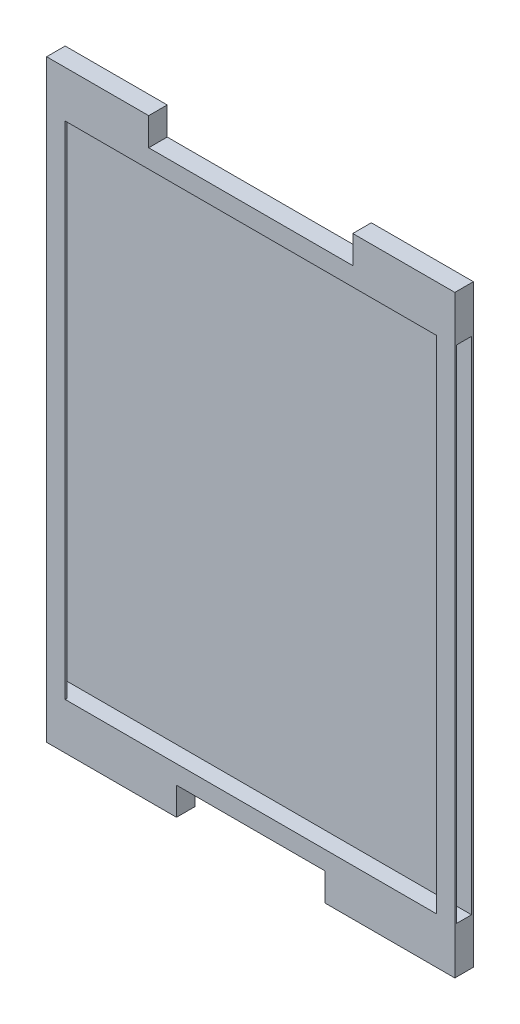
ISO-10303-21;
HEADER;
FILE_DESCRIPTION(('STEP AP214'),'2;1');
FILE_NAME('part.step','',(''),(''),'','','');
FILE_SCHEMA(('AUTOMOTIVE_DESIGN { 1 0 10303 214 1 1 1 1 }'));
ENDSEC;
DATA;
#1=APPLICATION_CONTEXT('core data for automotive mechanical design processes');
#2=APPLICATION_PROTOCOL_DEFINITION('international standard','automotive_design',2000,#1);
#3=PRODUCT_CONTEXT('',#1,'mechanical');
#4=PRODUCT('Part','Part','',(#3));
#5=PRODUCT_RELATED_PRODUCT_CATEGORY('part','',(#4));
#6=PRODUCT_DEFINITION_FORMATION('','',#4);
#7=PRODUCT_DEFINITION_CONTEXT('part definition',#1,'design');
#8=PRODUCT_DEFINITION('design','',#6,#7);
#9=PRODUCT_DEFINITION_SHAPE('','',#8);
#10=(LENGTH_UNIT() NAMED_UNIT(*) SI_UNIT(.MILLI.,.METRE.));
#11=(NAMED_UNIT(*) PLANE_ANGLE_UNIT() SI_UNIT($,.RADIAN.));
#12=(NAMED_UNIT(*) SI_UNIT($,.STERADIAN.) SOLID_ANGLE_UNIT());
#13=UNCERTAINTY_MEASURE_WITH_UNIT(LENGTH_MEASURE(1.E-05),#10,'distance_accuracy_value','');
#14=(GEOMETRIC_REPRESENTATION_CONTEXT(3) GLOBAL_UNCERTAINTY_ASSIGNED_CONTEXT((#13)) GLOBAL_UNIT_ASSIGNED_CONTEXT((#10,
#11,#12)) REPRESENTATION_CONTEXT('',''));
#15=CARTESIAN_POINT('',(0.,0.,0.));
#16=DIRECTION('',(0.,0.,1.));
#17=DIRECTION('',(1.,0.,0.));
#18=AXIS2_PLACEMENT_3D('',#15,#16,#17);
#19=CARTESIAN_POINT('',(-55.,0.,0.));
#20=DIRECTION('',(-1.,0.,0.));
#21=DIRECTION('',(0.,0.,1.));
#22=AXIS2_PLACEMENT_3D('',#19,#20,#21);
#23=PLANE('',#22);
#24=DIRECTION('',(0.,1.,0.));
#25=VECTOR('',#24,1.);
#26=CARTESIAN_POINT('',(-55.,0.,-5.));
#27=LINE('',#26,#25);
#28=CARTESIAN_POINT('',(-55.,145.,-5.));
#29=VERTEX_POINT('',#28);
#30=CARTESIAN_POINT('',(-55.,160.,-5.));
#31=VERTEX_POINT('',#30);
#32=EDGE_CURVE('E200',#29,#31,#27,.T.);
#33=ORIENTED_EDGE('',*,*,#32,.T.);
#34=DIRECTION('',(0.,0.,-1.));
#35=VECTOR('',#34,1.);
#36=CARTESIAN_POINT('',(-55.,160.,0.));
#37=LINE('',#36,#35);
#38=CARTESIAN_POINT('',(-55.,160.,5.));
#39=VERTEX_POINT('',#38);
#40=EDGE_CURVE('E272',#31,#39,#37,.F.);
#41=ORIENTED_EDGE('',*,*,#40,.T.);
#42=DIRECTION('',(0.,1.,0.));
#43=VECTOR('',#42,1.);
#44=CARTESIAN_POINT('',(-55.,0.,5.));
#45=LINE('',#44,#43);
#46=CARTESIAN_POINT('',(-55.,145.,5.));
#47=VERTEX_POINT('',#46);
#48=EDGE_CURVE('E203',#39,#47,#45,.F.);
#49=ORIENTED_EDGE('',*,*,#48,.T.);
#50=DIRECTION('',(0.,0.,-1.));
#51=VECTOR('',#50,1.);
#52=CARTESIAN_POINT('',(-55.,145.,0.));
#53=LINE('',#52,#51);
#54=EDGE_CURVE('E20',#47,#29,#53,.T.);
#55=ORIENTED_EDGE('',*,*,#54,.T.);
#56=EDGE_LOOP('',(#33,#41,#49,#55));
#57=FACE_BOUND('',#56,.T.);
#58=ADVANCED_FACE('F17',(#57),#23,.F.);
#59=CARTESIAN_POINT('',(0.,145.,0.));
#60=DIRECTION('',(0.,-1.,0.));
#61=DIRECTION('',(0.,0.,-1.));
#62=AXIS2_PLACEMENT_3D('',#59,#60,#61);
#63=PLANE('',#62);
#64=DIRECTION('',(1.,0.,0.));
#65=VECTOR('',#64,1.);
#66=CARTESIAN_POINT('',(0.,145.,-5.));
#67=LINE('',#66,#65);
#68=CARTESIAN_POINT('',(55.,145.,-5.));
#69=VERTEX_POINT('',#68);
#70=EDGE_CURVE('E207',#69,#29,#67,.F.);
#71=ORIENTED_EDGE('',*,*,#70,.T.);
#72=ORIENTED_EDGE('',*,*,#54,.F.);
#73=DIRECTION('',(1.,0.,0.));
#74=VECTOR('',#73,1.);
#75=CARTESIAN_POINT('',(0.,145.,5.));
#76=LINE('',#75,#74);
#77=CARTESIAN_POINT('',(55.,145.,5.));
#78=VERTEX_POINT('',#77);
#79=EDGE_CURVE('E251',#47,#78,#76,.T.);
#80=ORIENTED_EDGE('',*,*,#79,.T.);
#81=DIRECTION('',(0.,0.,-1.));
#82=VECTOR('',#81,1.);
#83=CARTESIAN_POINT('',(55.,145.,0.));
#84=LINE('',#83,#82);
#85=EDGE_CURVE('E193',#78,#69,#84,.T.);
#86=ORIENTED_EDGE('',*,*,#85,.T.);
#87=EDGE_LOOP('',(#71,#72,#80,#86));
#88=FACE_BOUND('',#87,.T.);
#89=ADVANCED_FACE('F211',(#88),#63,.F.);
#90=CARTESIAN_POINT('',(55.,0.,0.));
#91=DIRECTION('',(1.,0.,0.));
#92=DIRECTION('',(0.,0.,-1.));
#93=AXIS2_PLACEMENT_3D('',#90,#91,#92);
#94=PLANE('',#93);
#95=DIRECTION('',(0.,1.,0.));
#96=VECTOR('',#95,1.);
#97=CARTESIAN_POINT('',(55.,0.,-5.));
#98=LINE('',#97,#96);
#99=CARTESIAN_POINT('',(55.,160.,-5.));
#100=VERTEX_POINT('',#99);
#101=EDGE_CURVE('E212',#100,#69,#98,.F.);
#102=ORIENTED_EDGE('',*,*,#101,.T.);
#103=ORIENTED_EDGE('',*,*,#85,.F.);
#104=DIRECTION('',(0.,1.,0.));
#105=VECTOR('',#104,1.);
#106=CARTESIAN_POINT('',(55.,0.,5.));
#107=LINE('',#106,#105);
#108=CARTESIAN_POINT('',(55.,160.,5.));
#109=VERTEX_POINT('',#108);
#110=EDGE_CURVE('E248',#78,#109,#107,.T.);
#111=ORIENTED_EDGE('',*,*,#110,.T.);
#112=DIRECTION('',(0.,0.,-1.));
#113=VECTOR('',#112,1.);
#114=CARTESIAN_POINT('',(55.,160.,0.));
#115=LINE('',#114,#113);
#116=EDGE_CURVE('E192',#109,#100,#115,.T.);
#117=ORIENTED_EDGE('',*,*,#116,.T.);
#118=EDGE_LOOP('',(#102,#103,#111,#117));
#119=FACE_BOUND('',#118,.T.);
#120=ADVANCED_FACE('F417',(#119),#94,.F.);
#121=CARTESIAN_POINT('',(0.,160.,0.));
#122=DIRECTION('',(0.,-1.,0.));
#123=DIRECTION('',(0.,0.,-1.));
#124=AXIS2_PLACEMENT_3D('',#121,#122,#123);
#125=PLANE('',#124);
#126=DIRECTION('',(1.,0.,0.));
#127=VECTOR('',#126,1.);
#128=CARTESIAN_POINT('',(0.,160.,-5.));
#129=LINE('',#128,#127);
#130=CARTESIAN_POINT('',(110.,160.,-5.));
#131=VERTEX_POINT('',#130);
#132=EDGE_CURVE('E214',#131,#100,#129,.F.);
#133=ORIENTED_EDGE('',*,*,#132,.T.);
#134=ORIENTED_EDGE('',*,*,#116,.F.);
#135=DIRECTION('',(1.,0.,0.));
#136=VECTOR('',#135,1.);
#137=CARTESIAN_POINT('',(0.,160.,5.));
#138=LINE('',#137,#136);
#139=CARTESIAN_POINT('',(110.,160.,5.));
#140=VERTEX_POINT('',#139);
#141=EDGE_CURVE('E245',#109,#140,#138,.T.);
#142=ORIENTED_EDGE('',*,*,#141,.T.);
#143=DIRECTION('',(0.,0.,-1.));
#144=VECTOR('',#143,1.);
#145=CARTESIAN_POINT('',(110.,160.,0.));
#146=LINE('',#145,#144);
#147=EDGE_CURVE('E269',#140,#131,#146,.T.);
#148=ORIENTED_EDGE('',*,*,#147,.T.);
#149=EDGE_LOOP('',(#133,#134,#142,#148));
#150=FACE_BOUND('',#149,.T.);
#151=ADVANCED_FACE('F413',(#150),#125,.F.);
#152=CARTESIAN_POINT('',(0.,-160.,0.));
#153=DIRECTION('',(0.,1.,0.));
#154=DIRECTION('',(0.,0.,1.));
#155=AXIS2_PLACEMENT_3D('',#152,#153,#154);
#156=PLANE('',#155);
#157=DIRECTION('',(1.,0.,0.));
#158=VECTOR('',#157,1.);
#159=CARTESIAN_POINT('',(0.,-160.,-5.));
#160=LINE('',#159,#158);
#161=CARTESIAN_POINT('',(40.,-160.,-5.));
#162=VERTEX_POINT('',#161);
#163=CARTESIAN_POINT('',(110.,-160.,-5.));
#164=VERTEX_POINT('',#163);
#165=EDGE_CURVE('E220',#162,#164,#160,.T.);
#166=ORIENTED_EDGE('',*,*,#165,.T.);
#167=DIRECTION('',(0.,0.,-1.));
#168=VECTOR('',#167,1.);
#169=CARTESIAN_POINT('',(110.,-160.,0.));
#170=LINE('',#169,#168);
#171=CARTESIAN_POINT('',(110.,-160.,5.));
#172=VERTEX_POINT('',#171);
#173=EDGE_CURVE('E264',#164,#172,#170,.F.);
#174=ORIENTED_EDGE('',*,*,#173,.T.);
#175=DIRECTION('',(1.,0.,0.));
#176=VECTOR('',#175,1.);
#177=CARTESIAN_POINT('',(0.,-160.,5.));
#178=LINE('',#177,#176);
#179=CARTESIAN_POINT('',(40.,-160.,5.));
#180=VERTEX_POINT('',#179);
#181=EDGE_CURVE('E237',#172,#180,#178,.F.);
#182=ORIENTED_EDGE('',*,*,#181,.T.);
#183=DIRECTION('',(0.,0.,1.));
#184=VECTOR('',#183,1.);
#185=CARTESIAN_POINT('',(40.,-160.,0.));
#186=LINE('',#185,#184);
#187=EDGE_CURVE('E190',#180,#162,#186,.F.);
#188=ORIENTED_EDGE('',*,*,#187,.T.);
#189=EDGE_LOOP('',(#166,#174,#182,#188));
#190=FACE_BOUND('',#189,.T.);
#191=ADVANCED_FACE('F410',(#190),#156,.F.);
#192=CARTESIAN_POINT('',(40.,0.,0.));
#193=DIRECTION('',(-1.,0.,0.));
#194=DIRECTION('',(0.,0.,1.));
#195=AXIS2_PLACEMENT_3D('',#192,#193,#194);
#196=PLANE('',#195);
#197=DIRECTION('',(0.,1.,0.));
#198=VECTOR('',#197,1.);
#199=CARTESIAN_POINT('',(40.,0.,-5.));
#200=LINE('',#199,#198);
#201=CARTESIAN_POINT('',(40.,-145.,-5.));
#202=VERTEX_POINT('',#201);
#203=EDGE_CURVE('E222',#202,#162,#200,.F.);
#204=ORIENTED_EDGE('',*,*,#203,.T.);
#205=ORIENTED_EDGE('',*,*,#187,.F.);
#206=DIRECTION('',(0.,1.,0.));
#207=VECTOR('',#206,1.);
#208=CARTESIAN_POINT('',(40.,0.,5.));
#209=LINE('',#208,#207);
#210=CARTESIAN_POINT('',(40.,-145.,5.));
#211=VERTEX_POINT('',#210);
#212=EDGE_CURVE('E233',#180,#211,#209,.T.);
#213=ORIENTED_EDGE('',*,*,#212,.T.);
#214=DIRECTION('',(0.,0.,-1.));
#215=VECTOR('',#214,1.);
#216=CARTESIAN_POINT('',(40.,-145.,0.));
#217=LINE('',#216,#215);
#218=EDGE_CURVE('E188',#211,#202,#217,.T.);
#219=ORIENTED_EDGE('',*,*,#218,.T.);
#220=EDGE_LOOP('',(#204,#205,#213,#219));
#221=FACE_BOUND('',#220,.T.);
#222=ADVANCED_FACE('F236',(#221),#196,.T.);
#223=CARTESIAN_POINT('',(0.,-145.,0.));
#224=DIRECTION('',(0.,-1.,0.));
#225=DIRECTION('',(0.,0.,-1.));
#226=AXIS2_PLACEMENT_3D('',#223,#224,#225);
#227=PLANE('',#226);
#228=DIRECTION('',(1.,0.,0.));
#229=VECTOR('',#228,1.);
#230=CARTESIAN_POINT('',(0.,-145.,-5.));
#231=LINE('',#230,#229);
#232=CARTESIAN_POINT('',(-40.,-145.,-5.));
#233=VERTEX_POINT('',#232);
#234=EDGE_CURVE('E175',#233,#202,#231,.T.);
#235=ORIENTED_EDGE('',*,*,#234,.T.);
#236=ORIENTED_EDGE('',*,*,#218,.F.);
#237=DIRECTION('',(1.,0.,0.));
#238=VECTOR('',#237,1.);
#239=CARTESIAN_POINT('',(0.,-145.,5.));
#240=LINE('',#239,#238);
#241=CARTESIAN_POINT('',(-40.,-145.,5.));
#242=VERTEX_POINT('',#241);
#243=EDGE_CURVE('E226',#211,#242,#240,.F.);
#244=ORIENTED_EDGE('',*,*,#243,.T.);
#245=DIRECTION('',(0.,0.,-1.));
#246=VECTOR('',#245,1.);
#247=CARTESIAN_POINT('',(-40.,-145.,0.));
#248=LINE('',#247,#246);
#249=EDGE_CURVE('E151',#242,#233,#248,.T.);
#250=ORIENTED_EDGE('',*,*,#249,.T.);
#251=EDGE_LOOP('',(#235,#236,#244,#250));
#252=FACE_BOUND('',#251,.T.);
#253=ADVANCED_FACE('F224',(#252),#227,.T.);
#254=CARTESIAN_POINT('',(-40.,0.,0.));
#255=DIRECTION('',(1.,0.,0.));
#256=DIRECTION('',(0.,0.,-1.));
#257=AXIS2_PLACEMENT_3D('',#254,#255,#256);
#258=PLANE('',#257);
#259=DIRECTION('',(0.,1.,0.));
#260=VECTOR('',#259,1.);
#261=CARTESIAN_POINT('',(-40.,0.,-5.));
#262=LINE('',#261,#260);
#263=CARTESIAN_POINT('',(-40.,-160.,-5.));
#264=VERTEX_POINT('',#263);
#265=EDGE_CURVE('E160',#264,#233,#262,.T.);
#266=ORIENTED_EDGE('',*,*,#265,.T.);
#267=ORIENTED_EDGE('',*,*,#249,.F.);
#268=DIRECTION('',(0.,1.,0.));
#269=VECTOR('',#268,1.);
#270=CARTESIAN_POINT('',(-40.,0.,5.));
#271=LINE('',#270,#269);
#272=CARTESIAN_POINT('',(-40.,-160.,5.));
#273=VERTEX_POINT('',#272);
#274=EDGE_CURVE('E162',#242,#273,#271,.F.);
#275=ORIENTED_EDGE('',*,*,#274,.T.);
#276=DIRECTION('',(0.,0.,1.));
#277=VECTOR('',#276,1.);
#278=CARTESIAN_POINT('',(-40.,-160.,0.));
#279=LINE('',#278,#277);
#280=EDGE_CURVE('E157',#273,#264,#279,.F.);
#281=ORIENTED_EDGE('',*,*,#280,.T.);
#282=EDGE_LOOP('',(#266,#267,#275,#281));
#283=FACE_BOUND('',#282,.T.);
#284=ADVANCED_FACE('F159',(#283),#258,.T.);
#285=CARTESIAN_POINT('',(100.,0.,0.));
#286=DIRECTION('',(-1.,0.,0.));
#287=DIRECTION('',(0.,0.,1.));
#288=AXIS2_PLACEMENT_3D('',#285,#286,#287);
#289=PLANE('',#288);
#290=DIRECTION('',(0.,1.,0.));
#291=VECTOR('',#290,1.);
#292=CARTESIAN_POINT('',(100.,0.,5.));
#293=LINE('',#292,#291);
#294=CARTESIAN_POINT('',(100.,-135.,5.));
#295=VERTEX_POINT('',#294);
#296=CARTESIAN_POINT('',(100.,135.,5.));
#297=VERTEX_POINT('',#296);
#298=EDGE_CURVE('E305',#295,#297,#293,.T.);
#299=ORIENTED_EDGE('',*,*,#298,.T.);
#300=DIRECTION('',(0.,0.,1.));
#301=VECTOR('',#300,1.);
#302=CARTESIAN_POINT('',(100.,135.,0.));
#303=LINE('',#302,#301);
#304=CARTESIAN_POINT('',(100.,135.,4.));
#305=VERTEX_POINT('',#304);
#306=EDGE_CURVE('E185',#305,#297,#303,.T.);
#307=ORIENTED_EDGE('',*,*,#306,.F.);
#308=DIRECTION('',(0.,1.,0.));
#309=VECTOR('',#308,1.);
#310=CARTESIAN_POINT('',(100.,0.,4.));
#311=LINE('',#310,#309);
#312=CARTESIAN_POINT('',(100.,-135.,4.));
#313=VERTEX_POINT('',#312);
#314=EDGE_CURVE('E257',#305,#313,#311,.F.);
#315=ORIENTED_EDGE('',*,*,#314,.T.);
#316=DIRECTION('',(0.,0.,1.));
#317=VECTOR('',#316,1.);
#318=CARTESIAN_POINT('',(100.,-135.,0.));
#319=LINE('',#318,#317);
#320=EDGE_CURVE('E167',#295,#313,#319,.F.);
#321=ORIENTED_EDGE('',*,*,#320,.F.);
#322=EDGE_LOOP('',(#299,#307,#315,#321));
#323=FACE_BOUND('',#322,.T.);
#324=ADVANCED_FACE('F381',(#323),#289,.T.);
#325=CARTESIAN_POINT('',(0.,-160.,0.));
#326=DIRECTION('',(0.,1.,0.));
#327=DIRECTION('',(0.,0.,1.));
#328=AXIS2_PLACEMENT_3D('',#325,#326,#327);
#329=PLANE('',#328);
#330=DIRECTION('',(1.,0.,0.));
#331=VECTOR('',#330,1.);
#332=CARTESIAN_POINT('',(0.,-160.,-5.));
#333=LINE('',#332,#331);
#334=CARTESIAN_POINT('',(-110.,-160.,-5.));
#335=VERTEX_POINT('',#334);
#336=EDGE_CURVE('E166',#335,#264,#333,.T.);
#337=ORIENTED_EDGE('',*,*,#336,.T.);
#338=ORIENTED_EDGE('',*,*,#280,.F.);
#339=DIRECTION('',(1.,0.,0.));
#340=VECTOR('',#339,1.);
#341=CARTESIAN_POINT('',(0.,-160.,5.));
#342=LINE('',#341,#340);
#343=CARTESIAN_POINT('',(-110.,-160.,5.));
#344=VERTEX_POINT('',#343);
#345=EDGE_CURVE('E308',#273,#344,#342,.F.);
#346=ORIENTED_EDGE('',*,*,#345,.T.);
#347=DIRECTION('',(0.,0.,1.));
#348=VECTOR('',#347,1.);
#349=CARTESIAN_POINT('',(-110.,-160.,0.));
#350=LINE('',#349,#348);
#351=EDGE_CURVE('E180',#344,#335,#350,.F.);
#352=ORIENTED_EDGE('',*,*,#351,.T.);
#353=EDGE_LOOP('',(#337,#338,#346,#352));
#354=FACE_BOUND('',#353,.T.);
#355=ADVANCED_FACE('F178',(#354),#329,.F.);
#356=CARTESIAN_POINT('',(0.,0.,-5.));
#357=DIRECTION('',(0.,0.,1.));
#358=DIRECTION('',(1.,0.,0.));
#359=AXIS2_PLACEMENT_3D('',#356,#357,#358);
#360=PLANE('',#359);
#361=ORIENTED_EDGE('',*,*,#32,.F.);
#362=ORIENTED_EDGE('',*,*,#70,.F.);
#363=ORIENTED_EDGE('',*,*,#101,.F.);
#364=ORIENTED_EDGE('',*,*,#132,.F.);
#365=DIRECTION('',(0.,1.,0.));
#366=VECTOR('',#365,1.);
#367=CARTESIAN_POINT('',(110.,0.,-5.));
#368=LINE('',#367,#366);
#369=EDGE_CURVE('E266',#131,#164,#368,.F.);
#370=ORIENTED_EDGE('',*,*,#369,.T.);
#371=ORIENTED_EDGE('',*,*,#165,.F.);
#372=ORIENTED_EDGE('',*,*,#203,.F.);
#373=ORIENTED_EDGE('',*,*,#234,.F.);
#374=ORIENTED_EDGE('',*,*,#265,.F.);
#375=ORIENTED_EDGE('',*,*,#336,.F.);
#376=DIRECTION('',(0.,1.,0.));
#377=VECTOR('',#376,1.);
#378=CARTESIAN_POINT('',(-110.,0.,-5.));
#379=LINE('',#378,#377);
#380=CARTESIAN_POINT('',(-110.,160.,-5.));
#381=VERTEX_POINT('',#380);
#382=EDGE_CURVE('E283',#335,#381,#379,.T.);
#383=ORIENTED_EDGE('',*,*,#382,.T.);
#384=DIRECTION('',(1.,0.,0.));
#385=VECTOR('',#384,1.);
#386=CARTESIAN_POINT('',(0.,160.,-5.));
#387=LINE('',#386,#385);
#388=EDGE_CURVE('E209',#381,#31,#387,.T.);
#389=ORIENTED_EDGE('',*,*,#388,.T.);
#390=EDGE_LOOP('',(#361,#362,#363,#364,#370,#371,#372,#373,#374,#375,#383,#389));
#391=FACE_BOUND('',#390,.T.);
#392=ADVANCED_FACE('F171',(#391),#360,.F.);
#393=CARTESIAN_POINT('',(0.,160.,0.));
#394=DIRECTION('',(0.,-1.,0.));
#395=DIRECTION('',(0.,0.,-1.));
#396=AXIS2_PLACEMENT_3D('',#393,#394,#395);
#397=PLANE('',#396);
#398=ORIENTED_EDGE('',*,*,#388,.F.);
#399=DIRECTION('',(0.,0.,1.));
#400=VECTOR('',#399,1.);
#401=CARTESIAN_POINT('',(-110.,160.,0.));
#402=LINE('',#401,#400);
#403=CARTESIAN_POINT('',(-110.,160.,5.));
#404=VERTEX_POINT('',#403);
#405=EDGE_CURVE('E280',#381,#404,#402,.T.);
#406=ORIENTED_EDGE('',*,*,#405,.T.);
#407=DIRECTION('',(1.,0.,0.));
#408=VECTOR('',#407,1.);
#409=CARTESIAN_POINT('',(0.,160.,5.));
#410=LINE('',#409,#408);
#411=EDGE_CURVE('E254',#404,#39,#410,.T.);
#412=ORIENTED_EDGE('',*,*,#411,.T.);
#413=ORIENTED_EDGE('',*,*,#40,.F.);
#414=EDGE_LOOP('',(#398,#406,#412,#413));
#415=FACE_BOUND('',#414,.T.);
#416=ADVANCED_FACE('F278',(#415),#397,.F.);
#417=CARTESIAN_POINT('',(0.,0.,-4.));
#418=DIRECTION('',(0.,0.,-1.));
#419=DIRECTION('',(-1.,0.,0.));
#420=AXIS2_PLACEMENT_3D('',#417,#418,#419);
#421=PLANE('',#420);
#422=DIRECTION('',(1.,0.,0.));
#423=VECTOR('',#422,1.);
#424=CARTESIAN_POINT('',(0.,-135.,-4.));
#425=LINE('',#424,#423);
#426=CARTESIAN_POINT('',(-110.,-135.,-4.));
#427=VERTEX_POINT('',#426);
#428=CARTESIAN_POINT('',(110.,-135.,-4.));
#429=VERTEX_POINT('',#428);
#430=EDGE_CURVE('E362',#427,#429,#425,.T.);
#431=ORIENTED_EDGE('',*,*,#430,.T.);
#432=DIRECTION('',(0.,1.,0.));
#433=VECTOR('',#432,1.);
#434=CARTESIAN_POINT('',(110.,0.,-4.));
#435=LINE('',#434,#433);
#436=CARTESIAN_POINT('',(110.,135.,-4.));
#437=VERTEX_POINT('',#436);
#438=EDGE_CURVE('E262',#429,#437,#435,.T.);
#439=ORIENTED_EDGE('',*,*,#438,.T.);
#440=DIRECTION('',(1.,0.,0.));
#441=VECTOR('',#440,1.);
#442=CARTESIAN_POINT('',(0.,135.,-4.));
#443=LINE('',#442,#441);
#444=CARTESIAN_POINT('',(-110.,135.,-4.));
#445=VERTEX_POINT('',#444);
#446=EDGE_CURVE('E294',#437,#445,#443,.F.);
#447=ORIENTED_EDGE('',*,*,#446,.T.);
#448=DIRECTION('',(0.,1.,0.));
#449=VECTOR('',#448,1.);
#450=CARTESIAN_POINT('',(-110.,0.,-4.));
#451=LINE('',#450,#449);
#452=EDGE_CURVE('E286',#445,#427,#451,.F.);
#453=ORIENTED_EDGE('',*,*,#452,.T.);
#454=EDGE_LOOP('',(#431,#439,#447,#453));
#455=FACE_BOUND('',#454,.T.);
#456=ADVANCED_FACE('F367',(#455),#421,.F.);
#457=CARTESIAN_POINT('',(110.,0.,0.));
#458=DIRECTION('',(1.,0.,0.));
#459=DIRECTION('',(0.,0.,-1.));
#460=AXIS2_PLACEMENT_3D('',#457,#458,#459);
#461=PLANE('',#460);
#462=ORIENTED_EDGE('',*,*,#438,.F.);
#463=DIRECTION('',(0.,0.,1.));
#464=VECTOR('',#463,1.);
#465=CARTESIAN_POINT('',(110.,-135.,0.));
#466=LINE('',#465,#464);
#467=CARTESIAN_POINT('',(110.,-135.,4.));
#468=VERTEX_POINT('',#467);
#469=EDGE_CURVE('E359',#429,#468,#466,.T.);
#470=ORIENTED_EDGE('',*,*,#469,.T.);
#471=DIRECTION('',(0.,1.,0.));
#472=VECTOR('',#471,1.);
#473=CARTESIAN_POINT('',(110.,0.,4.));
#474=LINE('',#473,#472);
#475=CARTESIAN_POINT('',(110.,135.,4.));
#476=VERTEX_POINT('',#475);
#477=EDGE_CURVE('E260',#468,#476,#474,.T.);
#478=ORIENTED_EDGE('',*,*,#477,.T.);
#479=DIRECTION('',(0.,0.,-1.));
#480=VECTOR('',#479,1.);
#481=CARTESIAN_POINT('',(110.,135.,0.));
#482=LINE('',#481,#480);
#483=EDGE_CURVE('E296',#476,#437,#482,.T.);
#484=ORIENTED_EDGE('',*,*,#483,.T.);
#485=EDGE_LOOP('',(#462,#470,#478,#484));
#486=FACE_BOUND('',#485,.T.);
#487=ORIENTED_EDGE('',*,*,#369,.F.);
#488=ORIENTED_EDGE('',*,*,#147,.F.);
#489=DIRECTION('',(0.,1.,0.));
#490=VECTOR('',#489,1.);
#491=CARTESIAN_POINT('',(110.,0.,5.));
#492=LINE('',#491,#490);
#493=EDGE_CURVE('E239',#140,#172,#492,.F.);
#494=ORIENTED_EDGE('',*,*,#493,.T.);
#495=ORIENTED_EDGE('',*,*,#173,.F.);
#496=EDGE_LOOP('',(#487,#488,#494,#495));
#497=FACE_BOUND('',#496,.T.);
#498=ADVANCED_FACE('F372',(#486,#497),#461,.T.);
#499=CARTESIAN_POINT('',(0.,0.,4.));
#500=DIRECTION('',(0.,0.,1.));
#501=DIRECTION('',(1.,0.,0.));
#502=AXIS2_PLACEMENT_3D('',#499,#500,#501);
#503=PLANE('',#502);
#504=DIRECTION('',(1.,0.,0.));
#505=VECTOR('',#504,1.);
#506=CARTESIAN_POINT('',(0.,135.,4.));
#507=LINE('',#506,#505);
#508=EDGE_CURVE('E299',#305,#476,#507,.T.);
#509=ORIENTED_EDGE('',*,*,#508,.T.);
#510=ORIENTED_EDGE('',*,*,#477,.F.);
#511=DIRECTION('',(1.,0.,0.));
#512=VECTOR('',#511,1.);
#513=CARTESIAN_POINT('',(0.,-135.,4.));
#514=LINE('',#513,#512);
#515=EDGE_CURVE('E356',#468,#313,#514,.F.);
#516=ORIENTED_EDGE('',*,*,#515,.T.);
#517=ORIENTED_EDGE('',*,*,#314,.F.);
#518=EDGE_LOOP('',(#509,#510,#516,#517));
#519=FACE_BOUND('',#518,.T.);
#520=ADVANCED_FACE('F384',(#519),#503,.F.);
#521=CARTESIAN_POINT('',(0.,0.,5.));
#522=DIRECTION('',(0.,0.,1.));
#523=DIRECTION('',(1.,0.,0.));
#524=AXIS2_PLACEMENT_3D('',#521,#522,#523);
#525=PLANE('',#524);
#526=DIRECTION('',(1.,0.,0.));
#527=VECTOR('',#526,1.);
#528=CARTESIAN_POINT('',(0.,-135.,5.));
#529=LINE('',#528,#527);
#530=CARTESIAN_POINT('',(-100.,-135.,5.));
#531=VERTEX_POINT('',#530);
#532=EDGE_CURVE('E354',#295,#531,#529,.F.);
#533=ORIENTED_EDGE('',*,*,#532,.T.);
#534=DIRECTION('',(0.,1.,0.));
#535=VECTOR('',#534,1.);
#536=CARTESIAN_POINT('',(-100.,0.,5.));
#537=LINE('',#536,#535);
#538=CARTESIAN_POINT('',(-100.,135.,5.));
#539=VERTEX_POINT('',#538);
#540=EDGE_CURVE('E350',#531,#539,#537,.T.);
#541=ORIENTED_EDGE('',*,*,#540,.T.);
#542=DIRECTION('',(1.,0.,0.));
#543=VECTOR('',#542,1.);
#544=CARTESIAN_POINT('',(0.,135.,5.));
#545=LINE('',#544,#543);
#546=EDGE_CURVE('E302',#539,#297,#545,.T.);
#547=ORIENTED_EDGE('',*,*,#546,.T.);
#548=ORIENTED_EDGE('',*,*,#298,.F.);
#549=EDGE_LOOP('',(#533,#541,#547,#548));
#550=FACE_BOUND('',#549,.T.);
#551=ORIENTED_EDGE('',*,*,#345,.F.);
#552=ORIENTED_EDGE('',*,*,#274,.F.);
#553=ORIENTED_EDGE('',*,*,#243,.F.);
#554=ORIENTED_EDGE('',*,*,#212,.F.);
#555=ORIENTED_EDGE('',*,*,#181,.F.);
#556=ORIENTED_EDGE('',*,*,#493,.F.);
#557=ORIENTED_EDGE('',*,*,#141,.F.);
#558=ORIENTED_EDGE('',*,*,#110,.F.);
#559=ORIENTED_EDGE('',*,*,#79,.F.);
#560=ORIENTED_EDGE('',*,*,#48,.F.);
#561=ORIENTED_EDGE('',*,*,#411,.F.);
#562=DIRECTION('',(0.,1.,0.));
#563=VECTOR('',#562,1.);
#564=CARTESIAN_POINT('',(-110.,0.,5.));
#565=LINE('',#564,#563);
#566=EDGE_CURVE('E292',#404,#344,#565,.F.);
#567=ORIENTED_EDGE('',*,*,#566,.T.);
#568=EDGE_LOOP('',(#551,#552,#553,#554,#555,#556,#557,#558,#559,#560,#561,#567));
#569=FACE_BOUND('',#568,.T.);
#570=ADVANCED_FACE('F231',(#550,#569),#525,.T.);
#571=CARTESIAN_POINT('',(0.,135.,0.));
#572=DIRECTION('',(0.,-1.,0.));
#573=DIRECTION('',(0.,0.,-1.));
#574=AXIS2_PLACEMENT_3D('',#571,#572,#573);
#575=PLANE('',#574);
#576=ORIENTED_EDGE('',*,*,#483,.F.);
#577=ORIENTED_EDGE('',*,*,#508,.F.);
#578=ORIENTED_EDGE('',*,*,#306,.T.);
#579=ORIENTED_EDGE('',*,*,#546,.F.);
#580=DIRECTION('',(0.,0.,-1.));
#581=VECTOR('',#580,1.);
#582=CARTESIAN_POINT('',(-100.,135.,0.));
#583=LINE('',#582,#581);
#584=CARTESIAN_POINT('',(-100.,135.,4.));
#585=VERTEX_POINT('',#584);
#586=EDGE_CURVE('E345',#539,#585,#583,.T.);
#587=ORIENTED_EDGE('',*,*,#586,.T.);
#588=DIRECTION('',(1.,0.,0.));
#589=VECTOR('',#588,1.);
#590=CARTESIAN_POINT('',(0.,135.,4.));
#591=LINE('',#590,#589);
#592=CARTESIAN_POINT('',(-110.,135.,4.));
#593=VERTEX_POINT('',#592);
#594=EDGE_CURVE('E343',#585,#593,#591,.F.);
#595=ORIENTED_EDGE('',*,*,#594,.T.);
#596=DIRECTION('',(0.,0.,1.));
#597=VECTOR('',#596,1.);
#598=CARTESIAN_POINT('',(-110.,135.,0.));
#599=LINE('',#598,#597);
#600=EDGE_CURVE('E282',#593,#445,#599,.F.);
#601=ORIENTED_EDGE('',*,*,#600,.T.);
#602=ORIENTED_EDGE('',*,*,#446,.F.);
#603=EDGE_LOOP('',(#576,#577,#578,#579,#587,#595,#601,#602));
#604=FACE_BOUND('',#603,.T.);
#605=ADVANCED_FACE('F312',(#604),#575,.T.);
#606=CARTESIAN_POINT('',(-110.,0.,0.));
#607=DIRECTION('',(-1.,0.,0.));
#608=DIRECTION('',(0.,0.,1.));
#609=AXIS2_PLACEMENT_3D('',#606,#607,#608);
#610=PLANE('',#609);
#611=DIRECTION('',(0.,0.,1.));
#612=VECTOR('',#611,1.);
#613=CARTESIAN_POINT('',(-110.,-135.,0.));
#614=LINE('',#613,#612);
#615=CARTESIAN_POINT('',(-110.,-135.,4.));
#616=VERTEX_POINT('',#615);
#617=EDGE_CURVE('E342',#616,#427,#614,.F.);
#618=ORIENTED_EDGE('',*,*,#617,.T.);
#619=ORIENTED_EDGE('',*,*,#452,.F.);
#620=ORIENTED_EDGE('',*,*,#600,.F.);
#621=DIRECTION('',(0.,1.,0.));
#622=VECTOR('',#621,1.);
#623=CARTESIAN_POINT('',(-110.,0.,4.));
#624=LINE('',#623,#622);
#625=EDGE_CURVE('E338',#593,#616,#624,.F.);
#626=ORIENTED_EDGE('',*,*,#625,.T.);
#627=EDGE_LOOP('',(#618,#619,#620,#626));
#628=FACE_BOUND('',#627,.T.);
#629=ORIENTED_EDGE('',*,*,#382,.F.);
#630=ORIENTED_EDGE('',*,*,#351,.F.);
#631=ORIENTED_EDGE('',*,*,#566,.F.);
#632=ORIENTED_EDGE('',*,*,#405,.F.);
#633=EDGE_LOOP('',(#629,#630,#631,#632));
#634=FACE_BOUND('',#633,.T.);
#635=ADVANCED_FACE('F309',(#628,#634),#610,.T.);
#636=CARTESIAN_POINT('',(0.,-135.,0.));
#637=DIRECTION('',(0.,1.,0.));
#638=DIRECTION('',(0.,0.,1.));
#639=AXIS2_PLACEMENT_3D('',#636,#637,#638);
#640=PLANE('',#639);
#641=DIRECTION('',(0.,0.,-1.));
#642=VECTOR('',#641,1.);
#643=CARTESIAN_POINT('',(-100.,-135.,0.));
#644=LINE('',#643,#642);
#645=CARTESIAN_POINT('',(-100.,-135.,4.));
#646=VERTEX_POINT('',#645);
#647=EDGE_CURVE('E34',#646,#531,#644,.F.);
#648=ORIENTED_EDGE('',*,*,#647,.T.);
#649=ORIENTED_EDGE('',*,*,#532,.F.);
#650=ORIENTED_EDGE('',*,*,#320,.T.);
#651=ORIENTED_EDGE('',*,*,#515,.F.);
#652=ORIENTED_EDGE('',*,*,#469,.F.);
#653=ORIENTED_EDGE('',*,*,#430,.F.);
#654=ORIENTED_EDGE('',*,*,#617,.F.);
#655=DIRECTION('',(1.,0.,0.));
#656=VECTOR('',#655,1.);
#657=CARTESIAN_POINT('',(0.,-135.,4.));
#658=LINE('',#657,#656);
#659=EDGE_CURVE('E26',#616,#646,#658,.T.);
#660=ORIENTED_EDGE('',*,*,#659,.T.);
#661=EDGE_LOOP('',(#648,#649,#650,#651,#652,#653,#654,#660));
#662=FACE_BOUND('',#661,.T.);
#663=ADVANCED_FACE('F311',(#662),#640,.T.);
#664=CARTESIAN_POINT('',(-100.,0.,0.));
#665=DIRECTION('',(1.,0.,0.));
#666=DIRECTION('',(0.,0.,-1.));
#667=AXIS2_PLACEMENT_3D('',#664,#665,#666);
#668=PLANE('',#667);
#669=ORIENTED_EDGE('',*,*,#540,.F.);
#670=ORIENTED_EDGE('',*,*,#647,.F.);
#671=DIRECTION('',(0.,1.,0.));
#672=VECTOR('',#671,1.);
#673=CARTESIAN_POINT('',(-100.,0.,4.));
#674=LINE('',#673,#672);
#675=EDGE_CURVE('E11',#646,#585,#674,.T.);
#676=ORIENTED_EDGE('',*,*,#675,.T.);
#677=ORIENTED_EDGE('',*,*,#586,.F.);
#678=EDGE_LOOP('',(#669,#670,#676,#677));
#679=FACE_BOUND('',#678,.T.);
#680=ADVANCED_FACE('F320',(#679),#668,.T.);
#681=CARTESIAN_POINT('',(0.,0.,4.));
#682=DIRECTION('',(0.,0.,1.));
#683=DIRECTION('',(1.,0.,0.));
#684=AXIS2_PLACEMENT_3D('',#681,#682,#683);
#685=PLANE('',#684);
#686=ORIENTED_EDGE('',*,*,#659,.F.);
#687=ORIENTED_EDGE('',*,*,#625,.F.);
#688=ORIENTED_EDGE('',*,*,#594,.F.);
#689=ORIENTED_EDGE('',*,*,#675,.F.);
#690=EDGE_LOOP('',(#686,#687,#688,#689));
#691=FACE_BOUND('',#690,.T.);
#692=ADVANCED_FACE('F326',(#691),#685,.F.);
#693=CLOSED_SHELL('',(#58,#89,#120,#151,#191,#222,#253,#284,#324,#355,#392,#416,#456,#498,#520,
#570,#605,#635,#663,#680,#692));
#694=MANIFOLD_SOLID_BREP('B1',#693);
#695=ADVANCED_BREP_SHAPE_REPRESENTATION('',(#18,#694),#14);
#696=SHAPE_DEFINITION_REPRESENTATION(#9,#695);
ENDSEC;
END-ISO-10303-21;
